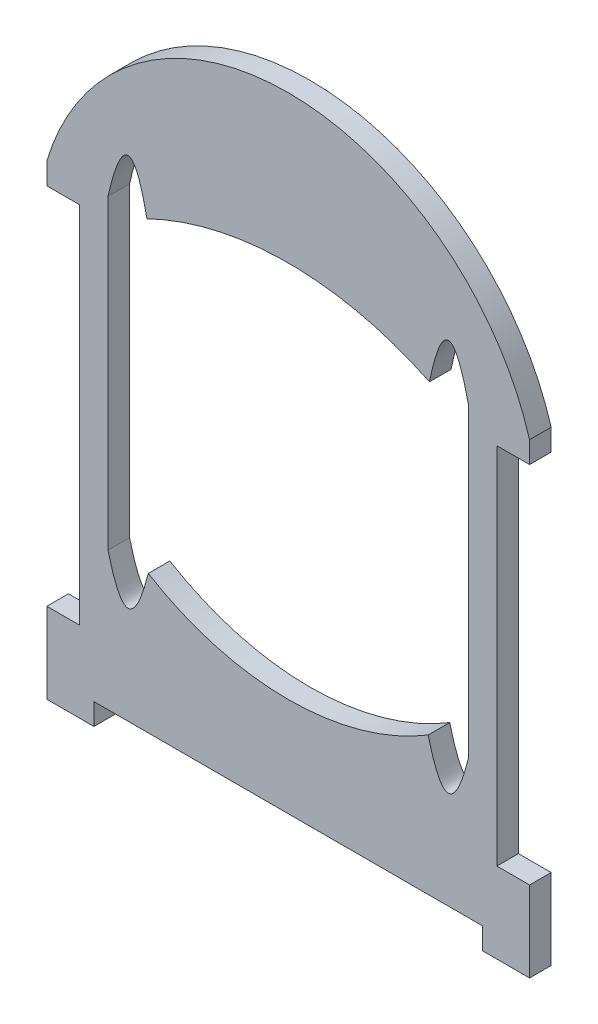
ISO-10303-21;
HEADER;
FILE_DESCRIPTION(('STEP AP214'),'2;1');
FILE_NAME('part.step','',(''),(''),'','','');
FILE_SCHEMA(('AUTOMOTIVE_DESIGN { 1 0 10303 214 1 1 1 1 }'));
ENDSEC;
DATA;
#1=APPLICATION_CONTEXT('core data for automotive mechanical design processes');
#2=APPLICATION_PROTOCOL_DEFINITION('international standard','automotive_design',2000,#1);
#3=PRODUCT_CONTEXT('',#1,'mechanical');
#4=PRODUCT('Part','Part','',(#3));
#5=PRODUCT_RELATED_PRODUCT_CATEGORY('part','',(#4));
#6=PRODUCT_DEFINITION_FORMATION('','',#4);
#7=PRODUCT_DEFINITION_CONTEXT('part definition',#1,'design');
#8=PRODUCT_DEFINITION('design','',#6,#7);
#9=PRODUCT_DEFINITION_SHAPE('','',#8);
#10=(LENGTH_UNIT() NAMED_UNIT(*) SI_UNIT(.MILLI.,.METRE.));
#11=(NAMED_UNIT(*) PLANE_ANGLE_UNIT() SI_UNIT($,.RADIAN.));
#12=(NAMED_UNIT(*) SI_UNIT($,.STERADIAN.) SOLID_ANGLE_UNIT());
#13=UNCERTAINTY_MEASURE_WITH_UNIT(LENGTH_MEASURE(1.E-05),#10,'distance_accuracy_value','');
#14=(GEOMETRIC_REPRESENTATION_CONTEXT(3) GLOBAL_UNCERTAINTY_ASSIGNED_CONTEXT((#13)) GLOBAL_UNIT_ASSIGNED_CONTEXT((#10,
#11,#12)) REPRESENTATION_CONTEXT('',''));
#15=CARTESIAN_POINT('',(0.,0.,0.));
#16=DIRECTION('',(0.,0.,1.));
#17=DIRECTION('',(1.,0.,0.));
#18=AXIS2_PLACEMENT_3D('',#15,#16,#17);
#19=CARTESIAN_POINT('',(-33.55,0.,3.));
#20=DIRECTION('',(0.,1.,0.));
#21=DIRECTION('',(-1.,0.,0.));
#22=AXIS2_PLACEMENT_3D('',#19,#20,#21);
#23=PLANE('',#22);
#24=DIRECTION('',(1.,0.,0.));
#25=VECTOR('',#24,1.);
#26=CARTESIAN_POINT('',(-33.55,0.,3.));
#27=LINE('',#26,#25);
#28=CARTESIAN_POINT('',(27.,0.,3.));
#29=VERTEX_POINT('',#28);
#30=CARTESIAN_POINT('',(33.55,0.,3.));
#31=VERTEX_POINT('',#30);
#32=EDGE_CURVE('E306',#29,#31,#27,.T.);
#33=ORIENTED_EDGE('',*,*,#32,.F.);
#34=DIRECTION('',(0.,0.,-1.));
#35=VECTOR('',#34,1.);
#36=CARTESIAN_POINT('',(27.,0.,3.));
#37=LINE('',#36,#35);
#38=CARTESIAN_POINT('',(27.,0.,0.));
#39=VERTEX_POINT('',#38);
#40=EDGE_CURVE('E47',#29,#39,#37,.T.);
#41=ORIENTED_EDGE('',*,*,#40,.T.);
#42=DIRECTION('',(1.,0.,0.));
#43=VECTOR('',#42,1.);
#44=CARTESIAN_POINT('',(-33.55,0.,0.));
#45=LINE('',#44,#43);
#46=CARTESIAN_POINT('',(33.55,0.,0.));
#47=VERTEX_POINT('',#46);
#48=EDGE_CURVE('E343',#39,#47,#45,.T.);
#49=ORIENTED_EDGE('',*,*,#48,.T.);
#50=DIRECTION('',(0.,0.,-1.));
#51=VECTOR('',#50,1.);
#52=CARTESIAN_POINT('',(33.55,0.,3.));
#53=LINE('',#52,#51);
#54=EDGE_CURVE('E309',#31,#47,#53,.T.);
#55=ORIENTED_EDGE('',*,*,#54,.F.);
#56=EDGE_LOOP('',(#33,#41,#49,#55));
#57=FACE_BOUND('',#56,.T.);
#58=ADVANCED_FACE('F39',(#57),#23,.F.);
#59=CARTESIAN_POINT('',(0.,54.78795,3.));
#60=DIRECTION('',(0.,0.,-1.));
#61=DIRECTION('',(-1.,0.,0.));
#62=AXIS2_PLACEMENT_3D('',#59,#60,#61);
#63=PLANE('',#62);
#64=DIRECTION('',(-1.,0.,0.));
#65=VECTOR('',#64,1.);
#66=CARTESIAN_POINT('',(-27.,3.00000000000001,3.));
#67=LINE('',#66,#65);
#68=CARTESIAN_POINT('',(27.,3.00000000000001,3.));
#69=VERTEX_POINT('',#68);
#70=CARTESIAN_POINT('',(-27.,3.00000000000001,3.));
#71=VERTEX_POINT('',#70);
#72=EDGE_CURVE('E204',#69,#71,#67,.T.);
#73=ORIENTED_EDGE('',*,*,#72,.F.);
#74=DIRECTION('',(0.,1.,0.));
#75=VECTOR('',#74,1.);
#76=CARTESIAN_POINT('',(27.,3.00000000000001,3.));
#77=LINE('',#76,#75);
#78=EDGE_CURVE('E211',#29,#69,#77,.T.);
#79=ORIENTED_EDGE('',*,*,#78,.F.);
#80=ORIENTED_EDGE('',*,*,#32,.T.);
#81=DIRECTION('',(0.,1.,0.));
#82=VECTOR('',#81,1.);
#83=CARTESIAN_POINT('',(33.55,0.,3.));
#84=LINE('',#83,#82);
#85=CARTESIAN_POINT('',(33.55,11.2,3.));
#86=VERTEX_POINT('',#85);
#87=EDGE_CURVE('E347',#31,#86,#84,.T.);
#88=ORIENTED_EDGE('',*,*,#87,.T.);
#89=DIRECTION('',(-1.,0.,0.));
#90=VECTOR('',#89,1.);
#91=CARTESIAN_POINT('',(33.55,11.2,3.));
#92=LINE('',#91,#90);
#93=CARTESIAN_POINT('',(29.,11.2,3.));
#94=VERTEX_POINT('',#93);
#95=EDGE_CURVE('E484',#86,#94,#92,.T.);
#96=ORIENTED_EDGE('',*,*,#95,.T.);
#97=DIRECTION('',(0.,1.,0.));
#98=VECTOR('',#97,1.);
#99=CARTESIAN_POINT('',(29.,11.2,3.));
#100=LINE('',#99,#98);
#101=CARTESIAN_POINT('',(29.,61.8,3.));
#102=VERTEX_POINT('',#101);
#103=EDGE_CURVE('E486',#94,#102,#100,.T.);
#104=ORIENTED_EDGE('',*,*,#103,.T.);
#105=DIRECTION('',(1.,0.,0.));
#106=VECTOR('',#105,1.);
#107=CARTESIAN_POINT('',(29.,61.8,3.));
#108=LINE('',#107,#106);
#109=CARTESIAN_POINT('',(33.55,61.8,3.));
#110=VERTEX_POINT('',#109);
#111=EDGE_CURVE('E488',#102,#110,#108,.T.);
#112=ORIENTED_EDGE('',*,*,#111,.T.);
#113=DIRECTION('',(0.,1.,0.));
#114=VECTOR('',#113,1.);
#115=CARTESIAN_POINT('',(33.55,61.8,3.));
#116=LINE('',#115,#114);
#117=CARTESIAN_POINT('',(33.55,64.8,3.));
#118=VERTEX_POINT('',#117);
#119=EDGE_CURVE('E490',#110,#118,#116,.T.);
#120=ORIENTED_EDGE('',*,*,#119,.T.);
#121=CARTESIAN_POINT('',(0.,54.78795,3.));
#122=DIRECTION('',(0.,0.,1.));
#123=DIRECTION('',(-1.,0.,0.));
#124=AXIS2_PLACEMENT_3D('',#121,#122,#123);
#125=CIRCLE('',#124,35.01205);
#126=CARTESIAN_POINT('',(-33.55,64.8,3.));
#127=VERTEX_POINT('',#126);
#128=EDGE_CURVE('E492',#118,#127,#125,.T.);
#129=ORIENTED_EDGE('',*,*,#128,.T.);
#130=DIRECTION('',(0.,-1.,0.));
#131=VECTOR('',#130,1.);
#132=CARTESIAN_POINT('',(-33.55,61.8,3.));
#133=LINE('',#132,#131);
#134=CARTESIAN_POINT('',(-33.55,61.8,3.));
#135=VERTEX_POINT('',#134);
#136=EDGE_CURVE('E494',#127,#135,#133,.T.);
#137=ORIENTED_EDGE('',*,*,#136,.T.);
#138=DIRECTION('',(1.,0.,0.));
#139=VECTOR('',#138,1.);
#140=CARTESIAN_POINT('',(-29.,61.8,3.));
#141=LINE('',#140,#139);
#142=CARTESIAN_POINT('',(-29.,61.8,3.));
#143=VERTEX_POINT('',#142);
#144=EDGE_CURVE('E496',#135,#143,#141,.T.);
#145=ORIENTED_EDGE('',*,*,#144,.T.);
#146=DIRECTION('',(0.,-1.,0.));
#147=VECTOR('',#146,1.);
#148=CARTESIAN_POINT('',(-29.,11.2,3.));
#149=LINE('',#148,#147);
#150=CARTESIAN_POINT('',(-29.,11.2,3.));
#151=VERTEX_POINT('',#150);
#152=EDGE_CURVE('E498',#143,#151,#149,.T.);
#153=ORIENTED_EDGE('',*,*,#152,.T.);
#154=DIRECTION('',(-1.,0.,0.));
#155=VECTOR('',#154,1.);
#156=CARTESIAN_POINT('',(-33.55,11.2,3.));
#157=LINE('',#156,#155);
#158=CARTESIAN_POINT('',(-33.55,11.2,3.));
#159=VERTEX_POINT('',#158);
#160=EDGE_CURVE('E315',#151,#159,#157,.T.);
#161=ORIENTED_EDGE('',*,*,#160,.T.);
#162=DIRECTION('',(0.,-1.,0.));
#163=VECTOR('',#162,1.);
#164=CARTESIAN_POINT('',(-33.55,0.,3.));
#165=LINE('',#164,#163);
#166=CARTESIAN_POINT('',(-33.55,0.,3.));
#167=VERTEX_POINT('',#166);
#168=EDGE_CURVE('E313',#159,#167,#165,.T.);
#169=ORIENTED_EDGE('',*,*,#168,.T.);
#170=CARTESIAN_POINT('',(-27.,0.,3.));
#171=VERTEX_POINT('',#170);
#172=EDGE_CURVE('E312',#167,#171,#27,.T.);
#173=ORIENTED_EDGE('',*,*,#172,.T.);
#174=DIRECTION('',(0.,-1.,0.));
#175=VECTOR('',#174,1.);
#176=CARTESIAN_POINT('',(-27.,0.,3.));
#177=LINE('',#176,#175);
#178=EDGE_CURVE('E54',#71,#171,#177,.T.);
#179=ORIENTED_EDGE('',*,*,#178,.F.);
#180=EDGE_LOOP('',(#73,#79,#80,#88,#96,#104,#112,#120,#129,#137,#145,#153,#161,#169,#173,#179));
#181=FACE_BOUND('',#180,.T.);
#182=CARTESIAN_POINT('',(-19.6329415672845,64.8,3.));
#183=CARTESIAN_POINT('',(-22.187059741983,77.4003496274557,3.));
#184=CARTESIAN_POINT('',(-25.05,64.8,3.));
#185=B_SPLINE_CURVE_WITH_KNOTS('',2,(#182,#183,#184),.UNSPECIFIED.,.F.,.F.,(3,3),(0.,1.),.UNSPECIFIED.);
#186=CARTESIAN_POINT('',(-19.6329415672845,64.8,3.));
#187=VERTEX_POINT('',#186);
#188=CARTESIAN_POINT('',(-25.05,64.8,3.));
#189=VERTEX_POINT('',#188);
#190=EDGE_CURVE('E229',#187,#189,#185,.T.);
#191=ORIENTED_EDGE('',*,*,#190,.F.);
#192=CARTESIAN_POINT('',(0.,24.2219561572877,3.));
#193=DIRECTION('',(0.,0.,1.));
#194=DIRECTION('',(1.,0.,0.));
#195=AXIS2_PLACEMENT_3D('',#192,#193,#194);
#196=CIRCLE('',#195,45.0780438427122);
#197=CARTESIAN_POINT('',(19.6329415672845,64.8,3.));
#198=VERTEX_POINT('',#197);
#199=EDGE_CURVE('E418',#198,#187,#196,.T.);
#200=ORIENTED_EDGE('',*,*,#199,.F.);
#201=CARTESIAN_POINT('',(25.05,64.8,3.));
#202=CARTESIAN_POINT('',(22.187059741983,77.4003496274557,3.));
#203=CARTESIAN_POINT('',(19.6329415672845,64.8,3.));
#204=B_SPLINE_CURVE_WITH_KNOTS('',2,(#201,#202,#203),.UNSPECIFIED.,.F.,.F.,(3,3),(0.,1.),.UNSPECIFIED.);
#205=CARTESIAN_POINT('',(25.05,64.8,3.));
#206=VERTEX_POINT('',#205);
#207=EDGE_CURVE('E412',#206,#198,#204,.T.);
#208=ORIENTED_EDGE('',*,*,#207,.F.);
#209=DIRECTION('',(0.,1.,0.));
#210=VECTOR('',#209,1.);
#211=CARTESIAN_POINT('',(25.05,22.2,3.));
#212=LINE('',#211,#210);
#213=CARTESIAN_POINT('',(25.05,22.2,3.));
#214=VERTEX_POINT('',#213);
#215=EDGE_CURVE('E419',#214,#206,#212,.T.);
#216=ORIENTED_EDGE('',*,*,#215,.F.);
#217=CARTESIAN_POINT('',(19.45,22.2,3.));
#218=CARTESIAN_POINT('',(22.25,11.,3.));
#219=CARTESIAN_POINT('',(25.05,22.2,3.));
#220=B_SPLINE_CURVE_WITH_KNOTS('',2,(#217,#218,#219),.UNSPECIFIED.,.F.,.F.,(3,3),(0.,1.),.UNSPECIFIED.);
#221=CARTESIAN_POINT('',(19.45,22.2,3.));
#222=VERTEX_POINT('',#221);
#223=EDGE_CURVE('E538',#222,#214,#220,.T.);
#224=ORIENTED_EDGE('',*,*,#223,.F.);
#225=CARTESIAN_POINT('',(0.,54.1816513761469,3.));
#226=DIRECTION('',(0.,0.,1.));
#227=DIRECTION('',(1.,0.,0.));
#228=AXIS2_PLACEMENT_3D('',#225,#226,#227);
#229=CIRCLE('',#228,37.4316513761469);
#230=CARTESIAN_POINT('',(-19.45,22.2,3.));
#231=VERTEX_POINT('',#230);
#232=EDGE_CURVE('E535',#231,#222,#229,.T.);
#233=ORIENTED_EDGE('',*,*,#232,.F.);
#234=CARTESIAN_POINT('',(-25.05,22.2,3.));
#235=CARTESIAN_POINT('',(-22.25,11.,3.));
#236=CARTESIAN_POINT('',(-19.45,22.2,3.));
#237=B_SPLINE_CURVE_WITH_KNOTS('',2,(#234,#235,#236),.UNSPECIFIED.,.F.,.F.,(3,3),(0.,1.),.UNSPECIFIED.);
#238=CARTESIAN_POINT('',(-25.05,22.2,3.));
#239=VERTEX_POINT('',#238);
#240=EDGE_CURVE('E533',#239,#231,#237,.T.);
#241=ORIENTED_EDGE('',*,*,#240,.F.);
#242=DIRECTION('',(0.,-1.,0.));
#243=VECTOR('',#242,1.);
#244=CARTESIAN_POINT('',(-25.05,64.8,3.));
#245=LINE('',#244,#243);
#246=EDGE_CURVE('E234',#189,#239,#245,.T.);
#247=ORIENTED_EDGE('',*,*,#246,.F.);
#248=EDGE_LOOP('',(#191,#200,#208,#216,#224,#233,#241,#247));
#249=FACE_BOUND('',#248,.T.);
#250=ADVANCED_FACE('F217',(#181,#249),#63,.F.);
#251=CARTESIAN_POINT('',(0.,54.78795,0.));
#252=DIRECTION('',(0.,0.,-1.));
#253=DIRECTION('',(-1.,0.,0.));
#254=AXIS2_PLACEMENT_3D('',#251,#252,#253);
#255=PLANE('',#254);
#256=DIRECTION('',(0.,-1.,0.));
#257=VECTOR('',#256,1.);
#258=CARTESIAN_POINT('',(27.0000000000001,54.7879499999999,0.));
#259=LINE('',#258,#257);
#260=CARTESIAN_POINT('',(27.,3.00000000000001,0.));
#261=VERTEX_POINT('',#260);
#262=EDGE_CURVE('E226',#261,#39,#259,.T.);
#263=ORIENTED_EDGE('',*,*,#262,.F.);
#264=DIRECTION('',(1.,0.,0.));
#265=VECTOR('',#264,1.);
#266=CARTESIAN_POINT('',(0.,3.00000000000002,0.));
#267=LINE('',#266,#265);
#268=CARTESIAN_POINT('',(-27.,3.00000000000001,0.));
#269=VERTEX_POINT('',#268);
#270=EDGE_CURVE('E11',#269,#261,#267,.T.);
#271=ORIENTED_EDGE('',*,*,#270,.F.);
#272=DIRECTION('',(0.,1.,0.));
#273=VECTOR('',#272,1.);
#274=CARTESIAN_POINT('',(-27.,54.78795,0.));
#275=LINE('',#274,#273);
#276=CARTESIAN_POINT('',(-27.,0.,0.));
#277=VERTEX_POINT('',#276);
#278=EDGE_CURVE('E223',#277,#269,#275,.T.);
#279=ORIENTED_EDGE('',*,*,#278,.F.);
#280=CARTESIAN_POINT('',(-33.55,0.,0.));
#281=VERTEX_POINT('',#280);
#282=EDGE_CURVE('E344',#281,#277,#45,.T.);
#283=ORIENTED_EDGE('',*,*,#282,.F.);
#284=DIRECTION('',(0.,-1.,0.));
#285=VECTOR('',#284,1.);
#286=CARTESIAN_POINT('',(-33.55,0.,0.));
#287=LINE('',#286,#285);
#288=CARTESIAN_POINT('',(-33.55,11.2,0.));
#289=VERTEX_POINT('',#288);
#290=EDGE_CURVE('E341',#289,#281,#287,.T.);
#291=ORIENTED_EDGE('',*,*,#290,.F.);
#292=DIRECTION('',(-1.,0.,0.));
#293=VECTOR('',#292,1.);
#294=CARTESIAN_POINT('',(-33.55,11.2,0.));
#295=LINE('',#294,#293);
#296=CARTESIAN_POINT('',(-29.,11.2,0.));
#297=VERTEX_POINT('',#296);
#298=EDGE_CURVE('E339',#297,#289,#295,.T.);
#299=ORIENTED_EDGE('',*,*,#298,.F.);
#300=DIRECTION('',(0.,-1.,0.));
#301=VECTOR('',#300,1.);
#302=CARTESIAN_POINT('',(-29.,11.2,0.));
#303=LINE('',#302,#301);
#304=CARTESIAN_POINT('',(-29.,61.8,0.));
#305=VERTEX_POINT('',#304);
#306=EDGE_CURVE('E337',#305,#297,#303,.T.);
#307=ORIENTED_EDGE('',*,*,#306,.F.);
#308=DIRECTION('',(1.,0.,0.));
#309=VECTOR('',#308,1.);
#310=CARTESIAN_POINT('',(-29.,61.8,0.));
#311=LINE('',#310,#309);
#312=CARTESIAN_POINT('',(-33.55,61.8,0.));
#313=VERTEX_POINT('',#312);
#314=EDGE_CURVE('E335',#313,#305,#311,.T.);
#315=ORIENTED_EDGE('',*,*,#314,.F.);
#316=DIRECTION('',(0.,-1.,0.));
#317=VECTOR('',#316,1.);
#318=CARTESIAN_POINT('',(-33.55,61.8,0.));
#319=LINE('',#318,#317);
#320=CARTESIAN_POINT('',(-33.55,64.8,0.));
#321=VERTEX_POINT('',#320);
#322=EDGE_CURVE('E333',#321,#313,#319,.T.);
#323=ORIENTED_EDGE('',*,*,#322,.F.);
#324=CARTESIAN_POINT('',(0.,54.78795,0.));
#325=DIRECTION('',(0.,0.,1.));
#326=DIRECTION('',(-1.,0.,0.));
#327=AXIS2_PLACEMENT_3D('',#324,#325,#326);
#328=CIRCLE('',#327,35.01205);
#329=CARTESIAN_POINT('',(33.55,64.8,0.));
#330=VERTEX_POINT('',#329);
#331=EDGE_CURVE('E331',#330,#321,#328,.T.);
#332=ORIENTED_EDGE('',*,*,#331,.F.);
#333=DIRECTION('',(0.,1.,0.));
#334=VECTOR('',#333,1.);
#335=CARTESIAN_POINT('',(33.55,61.8,0.));
#336=LINE('',#335,#334);
#337=CARTESIAN_POINT('',(33.55,61.8,0.));
#338=VERTEX_POINT('',#337);
#339=EDGE_CURVE('E329',#338,#330,#336,.T.);
#340=ORIENTED_EDGE('',*,*,#339,.F.);
#341=DIRECTION('',(1.,0.,0.));
#342=VECTOR('',#341,1.);
#343=CARTESIAN_POINT('',(29.,61.8,0.));
#344=LINE('',#343,#342);
#345=CARTESIAN_POINT('',(29.,61.8,0.));
#346=VERTEX_POINT('',#345);
#347=EDGE_CURVE('E327',#346,#338,#344,.T.);
#348=ORIENTED_EDGE('',*,*,#347,.F.);
#349=DIRECTION('',(0.,1.,0.));
#350=VECTOR('',#349,1.);
#351=CARTESIAN_POINT('',(29.,11.2,0.));
#352=LINE('',#351,#350);
#353=CARTESIAN_POINT('',(29.,11.2,0.));
#354=VERTEX_POINT('',#353);
#355=EDGE_CURVE('E325',#354,#346,#352,.T.);
#356=ORIENTED_EDGE('',*,*,#355,.F.);
#357=DIRECTION('',(-1.,0.,0.));
#358=VECTOR('',#357,1.);
#359=CARTESIAN_POINT('',(33.55,11.2,0.));
#360=LINE('',#359,#358);
#361=CARTESIAN_POINT('',(33.55,11.2,0.));
#362=VERTEX_POINT('',#361);
#363=EDGE_CURVE('E322',#362,#354,#360,.T.);
#364=ORIENTED_EDGE('',*,*,#363,.F.);
#365=DIRECTION('',(0.,1.,0.));
#366=VECTOR('',#365,1.);
#367=CARTESIAN_POINT('',(33.55,0.,0.));
#368=LINE('',#367,#366);
#369=EDGE_CURVE('E319',#47,#362,#368,.T.);
#370=ORIENTED_EDGE('',*,*,#369,.F.);
#371=ORIENTED_EDGE('',*,*,#48,.F.);
#372=EDGE_LOOP('',(#263,#271,#279,#283,#291,#299,#307,#315,#323,#332,#340,#348,#356,#364,#370,#371));
#373=FACE_BOUND('',#372,.T.);
#374=CARTESIAN_POINT('',(0.,24.2219561572877,0.));
#375=DIRECTION('',(0.,0.,1.));
#376=DIRECTION('',(1.,0.,0.));
#377=AXIS2_PLACEMENT_3D('',#374,#375,#376);
#378=CIRCLE('',#377,45.0780438427122);
#379=CARTESIAN_POINT('',(19.6329415672845,64.8,0.));
#380=VERTEX_POINT('',#379);
#381=CARTESIAN_POINT('',(-19.6329415672845,64.8,0.));
#382=VERTEX_POINT('',#381);
#383=EDGE_CURVE('E235',#380,#382,#378,.T.);
#384=ORIENTED_EDGE('',*,*,#383,.T.);
#385=CARTESIAN_POINT('',(-19.6329415672845,64.8,0.));
#386=CARTESIAN_POINT('',(-22.187059741983,77.4003496274557,0.));
#387=CARTESIAN_POINT('',(-25.05,64.8,0.));
#388=B_SPLINE_CURVE_WITH_KNOTS('',2,(#385,#386,#387),.UNSPECIFIED.,.F.,.F.,(3,3),(0.,1.),.UNSPECIFIED.);
#389=CARTESIAN_POINT('',(-25.05,64.8,0.));
#390=VERTEX_POINT('',#389);
#391=EDGE_CURVE('E228',#382,#390,#388,.T.);
#392=ORIENTED_EDGE('',*,*,#391,.T.);
#393=DIRECTION('',(0.,-1.,0.));
#394=VECTOR('',#393,1.);
#395=CARTESIAN_POINT('',(-25.05,64.8,0.));
#396=LINE('',#395,#394);
#397=CARTESIAN_POINT('',(-25.05,22.2,0.));
#398=VERTEX_POINT('',#397);
#399=EDGE_CURVE('E430',#390,#398,#396,.T.);
#400=ORIENTED_EDGE('',*,*,#399,.T.);
#401=CARTESIAN_POINT('',(-25.05,22.2,0.));
#402=CARTESIAN_POINT('',(-22.25,11.,0.));
#403=CARTESIAN_POINT('',(-19.45,22.2,0.));
#404=B_SPLINE_CURVE_WITH_KNOTS('',2,(#401,#402,#403),.UNSPECIFIED.,.F.,.F.,(3,3),(0.,1.),.UNSPECIFIED.);
#405=CARTESIAN_POINT('',(-19.45,22.2,0.));
#406=VERTEX_POINT('',#405);
#407=EDGE_CURVE('E436',#398,#406,#404,.T.);
#408=ORIENTED_EDGE('',*,*,#407,.T.);
#409=CARTESIAN_POINT('',(0.,54.1816513761469,0.));
#410=DIRECTION('',(0.,0.,1.));
#411=DIRECTION('',(1.,0.,0.));
#412=AXIS2_PLACEMENT_3D('',#409,#410,#411);
#413=CIRCLE('',#412,37.4316513761469);
#414=CARTESIAN_POINT('',(19.45,22.2,0.));
#415=VERTEX_POINT('',#414);
#416=EDGE_CURVE('E441',#406,#415,#413,.T.);
#417=ORIENTED_EDGE('',*,*,#416,.T.);
#418=CARTESIAN_POINT('',(19.45,22.2,0.));
#419=CARTESIAN_POINT('',(22.25,11.,0.));
#420=CARTESIAN_POINT('',(25.05,22.2,0.));
#421=B_SPLINE_CURVE_WITH_KNOTS('',2,(#418,#419,#420),.UNSPECIFIED.,.F.,.F.,(3,3),(0.,1.),.UNSPECIFIED.);
#422=CARTESIAN_POINT('',(25.05,22.2,0.));
#423=VERTEX_POINT('',#422);
#424=EDGE_CURVE('E447',#415,#423,#421,.T.);
#425=ORIENTED_EDGE('',*,*,#424,.T.);
#426=DIRECTION('',(0.,1.,0.));
#427=VECTOR('',#426,1.);
#428=CARTESIAN_POINT('',(25.05,22.2,0.));
#429=LINE('',#428,#427);
#430=CARTESIAN_POINT('',(25.05,64.8,0.));
#431=VERTEX_POINT('',#430);
#432=EDGE_CURVE('E452',#423,#431,#429,.T.);
#433=ORIENTED_EDGE('',*,*,#432,.T.);
#434=CARTESIAN_POINT('',(25.05,64.8,0.));
#435=CARTESIAN_POINT('',(22.187059741983,77.4003496274557,0.));
#436=CARTESIAN_POINT('',(19.6329415672845,64.8,0.));
#437=B_SPLINE_CURVE_WITH_KNOTS('',2,(#434,#435,#436),.UNSPECIFIED.,.F.,.F.,(3,3),(0.,1.),.UNSPECIFIED.);
#438=EDGE_CURVE('E458',#431,#380,#437,.T.);
#439=ORIENTED_EDGE('',*,*,#438,.T.);
#440=EDGE_LOOP('',(#384,#392,#400,#408,#417,#425,#433,#439));
#441=FACE_BOUND('',#440,.T.);
#442=ADVANCED_FACE('F251',(#373,#441),#255,.T.);
#443=CARTESIAN_POINT('',(33.55,0.,3.));
#444=DIRECTION('',(-1.,0.,0.));
#445=DIRECTION('',(0.,-1.,0.));
#446=AXIS2_PLACEMENT_3D('',#443,#444,#445);
#447=PLANE('',#446);
#448=ORIENTED_EDGE('',*,*,#369,.T.);
#449=DIRECTION('',(0.,0.,-1.));
#450=VECTOR('',#449,1.);
#451=CARTESIAN_POINT('',(33.55,11.2,3.));
#452=LINE('',#451,#450);
#453=EDGE_CURVE('E379',#86,#362,#452,.T.);
#454=ORIENTED_EDGE('',*,*,#453,.F.);
#455=ORIENTED_EDGE('',*,*,#87,.F.);
#456=ORIENTED_EDGE('',*,*,#54,.T.);
#457=EDGE_LOOP('',(#448,#454,#455,#456));
#458=FACE_BOUND('',#457,.T.);
#459=ADVANCED_FACE('F41',(#458),#447,.F.);
#460=CARTESIAN_POINT('',(33.55,11.2,3.));
#461=DIRECTION('',(0.,-1.,0.));
#462=DIRECTION('',(1.,0.,0.));
#463=AXIS2_PLACEMENT_3D('',#460,#461,#462);
#464=PLANE('',#463);
#465=ORIENTED_EDGE('',*,*,#363,.T.);
#466=DIRECTION('',(0.,0.,-1.));
#467=VECTOR('',#466,1.);
#468=CARTESIAN_POINT('',(29.,11.2,3.));
#469=LINE('',#468,#467);
#470=EDGE_CURVE('E376',#94,#354,#469,.T.);
#471=ORIENTED_EDGE('',*,*,#470,.F.);
#472=ORIENTED_EDGE('',*,*,#95,.F.);
#473=ORIENTED_EDGE('',*,*,#453,.T.);
#474=EDGE_LOOP('',(#465,#471,#472,#473));
#475=FACE_BOUND('',#474,.T.);
#476=ADVANCED_FACE('F292',(#475),#464,.F.);
#477=CARTESIAN_POINT('',(29.,11.2,3.));
#478=DIRECTION('',(-1.,0.,0.));
#479=DIRECTION('',(0.,-1.,0.));
#480=AXIS2_PLACEMENT_3D('',#477,#478,#479);
#481=PLANE('',#480);
#482=ORIENTED_EDGE('',*,*,#355,.T.);
#483=DIRECTION('',(0.,0.,-1.));
#484=VECTOR('',#483,1.);
#485=CARTESIAN_POINT('',(29.,61.8,3.));
#486=LINE('',#485,#484);
#487=EDGE_CURVE('E373',#102,#346,#486,.T.);
#488=ORIENTED_EDGE('',*,*,#487,.F.);
#489=ORIENTED_EDGE('',*,*,#103,.F.);
#490=ORIENTED_EDGE('',*,*,#470,.T.);
#491=EDGE_LOOP('',(#482,#488,#489,#490));
#492=FACE_BOUND('',#491,.T.);
#493=ADVANCED_FACE('F289',(#492),#481,.F.);
#494=CARTESIAN_POINT('',(29.,61.8,3.));
#495=DIRECTION('',(0.,1.,0.));
#496=DIRECTION('',(0.,0.,1.));
#497=AXIS2_PLACEMENT_3D('',#494,#495,#496);
#498=PLANE('',#497);
#499=ORIENTED_EDGE('',*,*,#347,.T.);
#500=DIRECTION('',(0.,0.,-1.));
#501=VECTOR('',#500,1.);
#502=CARTESIAN_POINT('',(33.55,61.8,3.));
#503=LINE('',#502,#501);
#504=EDGE_CURVE('E370',#110,#338,#503,.T.);
#505=ORIENTED_EDGE('',*,*,#504,.F.);
#506=ORIENTED_EDGE('',*,*,#111,.F.);
#507=ORIENTED_EDGE('',*,*,#487,.T.);
#508=EDGE_LOOP('',(#499,#505,#506,#507));
#509=FACE_BOUND('',#508,.T.);
#510=ADVANCED_FACE('F285',(#509),#498,.F.);
#511=CARTESIAN_POINT('',(33.55,61.8,3.));
#512=DIRECTION('',(-1.,0.,0.));
#513=DIRECTION('',(0.,0.,1.));
#514=AXIS2_PLACEMENT_3D('',#511,#512,#513);
#515=PLANE('',#514);
#516=ORIENTED_EDGE('',*,*,#339,.T.);
#517=DIRECTION('',(0.,0.,-1.));
#518=VECTOR('',#517,1.);
#519=CARTESIAN_POINT('',(33.55,64.8,3.));
#520=LINE('',#519,#518);
#521=EDGE_CURVE('E367',#118,#330,#520,.T.);
#522=ORIENTED_EDGE('',*,*,#521,.F.);
#523=ORIENTED_EDGE('',*,*,#119,.F.);
#524=ORIENTED_EDGE('',*,*,#504,.T.);
#525=EDGE_LOOP('',(#516,#522,#523,#524));
#526=FACE_BOUND('',#525,.T.);
#527=ADVANCED_FACE('F281',(#526),#515,.F.);
#528=CARTESIAN_POINT('',(0.,54.78795,3.));
#529=DIRECTION('',(0.,0.,-1.));
#530=DIRECTION('',(-1.,0.,0.));
#531=AXIS2_PLACEMENT_3D('',#528,#529,#530);
#532=CYLINDRICAL_SURFACE('',#531,35.01205);
#533=ORIENTED_EDGE('',*,*,#331,.T.);
#534=DIRECTION('',(0.,0.,-1.));
#535=VECTOR('',#534,1.);
#536=CARTESIAN_POINT('',(-33.55,64.8,3.));
#537=LINE('',#536,#535);
#538=EDGE_CURVE('E364',#127,#321,#537,.T.);
#539=ORIENTED_EDGE('',*,*,#538,.F.);
#540=ORIENTED_EDGE('',*,*,#128,.F.);
#541=ORIENTED_EDGE('',*,*,#521,.T.);
#542=EDGE_LOOP('',(#533,#539,#540,#541));
#543=FACE_BOUND('',#542,.T.);
#544=ADVANCED_FACE('F277',(#543),#532,.T.);
#545=CARTESIAN_POINT('',(-33.55,61.8,3.));
#546=DIRECTION('',(1.,0.,0.));
#547=DIRECTION('',(0.,0.,-1.));
#548=AXIS2_PLACEMENT_3D('',#545,#546,#547);
#549=PLANE('',#548);
#550=ORIENTED_EDGE('',*,*,#322,.T.);
#551=DIRECTION('',(0.,0.,-1.));
#552=VECTOR('',#551,1.);
#553=CARTESIAN_POINT('',(-33.55,61.8,3.));
#554=LINE('',#553,#552);
#555=EDGE_CURVE('E361',#135,#313,#554,.T.);
#556=ORIENTED_EDGE('',*,*,#555,.F.);
#557=ORIENTED_EDGE('',*,*,#136,.F.);
#558=ORIENTED_EDGE('',*,*,#538,.T.);
#559=EDGE_LOOP('',(#550,#556,#557,#558));
#560=FACE_BOUND('',#559,.T.);
#561=ADVANCED_FACE('F273',(#560),#549,.F.);
#562=CARTESIAN_POINT('',(-29.,61.8,3.));
#563=DIRECTION('',(0.,1.,0.));
#564=DIRECTION('',(-1.,0.,0.));
#565=AXIS2_PLACEMENT_3D('',#562,#563,#564);
#566=PLANE('',#565);
#567=ORIENTED_EDGE('',*,*,#314,.T.);
#568=DIRECTION('',(0.,0.,-1.));
#569=VECTOR('',#568,1.);
#570=CARTESIAN_POINT('',(-29.,61.8,3.));
#571=LINE('',#570,#569);
#572=EDGE_CURVE('E358',#143,#305,#571,.T.);
#573=ORIENTED_EDGE('',*,*,#572,.F.);
#574=ORIENTED_EDGE('',*,*,#144,.F.);
#575=ORIENTED_EDGE('',*,*,#555,.T.);
#576=EDGE_LOOP('',(#567,#573,#574,#575));
#577=FACE_BOUND('',#576,.T.);
#578=ADVANCED_FACE('F269',(#577),#566,.F.);
#579=CARTESIAN_POINT('',(-29.,11.2,3.));
#580=DIRECTION('',(1.,0.,0.));
#581=DIRECTION('',(0.,1.,0.));
#582=AXIS2_PLACEMENT_3D('',#579,#580,#581);
#583=PLANE('',#582);
#584=ORIENTED_EDGE('',*,*,#306,.T.);
#585=DIRECTION('',(0.,0.,-1.));
#586=VECTOR('',#585,1.);
#587=CARTESIAN_POINT('',(-29.,11.2,3.));
#588=LINE('',#587,#586);
#589=EDGE_CURVE('E355',#151,#297,#588,.T.);
#590=ORIENTED_EDGE('',*,*,#589,.F.);
#591=ORIENTED_EDGE('',*,*,#152,.F.);
#592=ORIENTED_EDGE('',*,*,#572,.T.);
#593=EDGE_LOOP('',(#584,#590,#591,#592));
#594=FACE_BOUND('',#593,.T.);
#595=ADVANCED_FACE('F265',(#594),#583,.F.);
#596=CARTESIAN_POINT('',(-33.55,11.2,3.));
#597=DIRECTION('',(0.,-1.,0.));
#598=DIRECTION('',(0.,0.,-1.));
#599=AXIS2_PLACEMENT_3D('',#596,#597,#598);
#600=PLANE('',#599);
#601=ORIENTED_EDGE('',*,*,#298,.T.);
#602=DIRECTION('',(0.,0.,-1.));
#603=VECTOR('',#602,1.);
#604=CARTESIAN_POINT('',(-33.55,11.2,3.));
#605=LINE('',#604,#603);
#606=EDGE_CURVE('E352',#159,#289,#605,.T.);
#607=ORIENTED_EDGE('',*,*,#606,.F.);
#608=ORIENTED_EDGE('',*,*,#160,.F.);
#609=ORIENTED_EDGE('',*,*,#589,.T.);
#610=EDGE_LOOP('',(#601,#607,#608,#609));
#611=FACE_BOUND('',#610,.T.);
#612=ADVANCED_FACE('F261',(#611),#600,.F.);
#613=CARTESIAN_POINT('',(-33.55,0.,3.));
#614=DIRECTION('',(1.,0.,0.));
#615=DIRECTION('',(0.,1.,0.));
#616=AXIS2_PLACEMENT_3D('',#613,#614,#615);
#617=PLANE('',#616);
#618=ORIENTED_EDGE('',*,*,#290,.T.);
#619=DIRECTION('',(0.,0.,-1.));
#620=VECTOR('',#619,1.);
#621=CARTESIAN_POINT('',(-33.55,0.,3.));
#622=LINE('',#621,#620);
#623=EDGE_CURVE('E349',#167,#281,#622,.T.);
#624=ORIENTED_EDGE('',*,*,#623,.F.);
#625=ORIENTED_EDGE('',*,*,#168,.F.);
#626=ORIENTED_EDGE('',*,*,#606,.T.);
#627=EDGE_LOOP('',(#618,#624,#625,#626));
#628=FACE_BOUND('',#627,.T.);
#629=ADVANCED_FACE('F257',(#628),#617,.F.);
#630=ORIENTED_EDGE('',*,*,#282,.T.);
#631=DIRECTION('',(0.,0.,1.));
#632=VECTOR('',#631,1.);
#633=CARTESIAN_POINT('',(-27.,0.,3.));
#634=LINE('',#633,#632);
#635=EDGE_CURVE('E382',#277,#171,#634,.T.);
#636=ORIENTED_EDGE('',*,*,#635,.T.);
#637=ORIENTED_EDGE('',*,*,#172,.F.);
#638=ORIENTED_EDGE('',*,*,#623,.T.);
#639=EDGE_LOOP('',(#630,#636,#637,#638));
#640=FACE_BOUND('',#639,.T.);
#641=ADVANCED_FACE('F246',(#640),#23,.F.);
#642=DIRECTION('',(0.,0.,-1.));
#643=VECTOR('',#642,1.);
#644=SURFACE_OF_LINEAR_EXTRUSION('',#185,#643);
#645=ORIENTED_EDGE('',*,*,#391,.F.);
#646=DIRECTION('',(0.,0.,-1.));
#647=VECTOR('',#646,1.);
#648=CARTESIAN_POINT('',(-19.6329415672845,64.8,3.));
#649=LINE('',#648,#647);
#650=EDGE_CURVE('E425',#187,#382,#649,.T.);
#651=ORIENTED_EDGE('',*,*,#650,.F.);
#652=ORIENTED_EDGE('',*,*,#190,.T.);
#653=DIRECTION('',(0.,0.,-1.));
#654=VECTOR('',#653,1.);
#655=CARTESIAN_POINT('',(-25.05,64.8,3.));
#656=LINE('',#655,#654);
#657=EDGE_CURVE('E323',#189,#390,#656,.T.);
#658=ORIENTED_EDGE('',*,*,#657,.T.);
#659=EDGE_LOOP('',(#645,#651,#652,#658));
#660=FACE_BOUND('',#659,.T.);
#661=ADVANCED_FACE('F241',(#660),#644,.T.);
#662=CARTESIAN_POINT('',(-25.05,64.8,3.));
#663=DIRECTION('',(1.,0.,0.));
#664=DIRECTION('',(0.,1.,0.));
#665=AXIS2_PLACEMENT_3D('',#662,#663,#664);
#666=PLANE('',#665);
#667=ORIENTED_EDGE('',*,*,#399,.F.);
#668=ORIENTED_EDGE('',*,*,#657,.F.);
#669=ORIENTED_EDGE('',*,*,#246,.T.);
#670=DIRECTION('',(0.,0.,-1.));
#671=VECTOR('',#670,1.);
#672=CARTESIAN_POINT('',(-25.05,22.2,3.));
#673=LINE('',#672,#671);
#674=EDGE_CURVE('E479',#239,#398,#673,.T.);
#675=ORIENTED_EDGE('',*,*,#674,.T.);
#676=EDGE_LOOP('',(#667,#668,#669,#675));
#677=FACE_BOUND('',#676,.T.);
#678=ADVANCED_FACE('F245',(#677),#666,.T.);
#679=DIRECTION('',(0.,0.,-1.));
#680=VECTOR('',#679,1.);
#681=SURFACE_OF_LINEAR_EXTRUSION('',#237,#680);
#682=ORIENTED_EDGE('',*,*,#407,.F.);
#683=ORIENTED_EDGE('',*,*,#674,.F.);
#684=ORIENTED_EDGE('',*,*,#240,.T.);
#685=DIRECTION('',(0.,0.,-1.));
#686=VECTOR('',#685,1.);
#687=CARTESIAN_POINT('',(-19.45,22.2,3.));
#688=LINE('',#687,#686);
#689=EDGE_CURVE('E477',#231,#406,#688,.T.);
#690=ORIENTED_EDGE('',*,*,#689,.T.);
#691=EDGE_LOOP('',(#682,#683,#684,#690));
#692=FACE_BOUND('',#691,.T.);
#693=ADVANCED_FACE('F546',(#692),#681,.T.);
#694=CARTESIAN_POINT('',(0.,54.1816513761469,3.));
#695=DIRECTION('',(0.,0.,-1.));
#696=DIRECTION('',(-1.,0.,0.));
#697=AXIS2_PLACEMENT_3D('',#694,#695,#696);
#698=CYLINDRICAL_SURFACE('',#697,37.4316513761469);
#699=ORIENTED_EDGE('',*,*,#416,.F.);
#700=ORIENTED_EDGE('',*,*,#689,.F.);
#701=ORIENTED_EDGE('',*,*,#232,.T.);
#702=DIRECTION('',(0.,0.,-1.));
#703=VECTOR('',#702,1.);
#704=CARTESIAN_POINT('',(19.45,22.2,3.));
#705=LINE('',#704,#703);
#706=EDGE_CURVE('E475',#222,#415,#705,.T.);
#707=ORIENTED_EDGE('',*,*,#706,.T.);
#708=EDGE_LOOP('',(#699,#700,#701,#707));
#709=FACE_BOUND('',#708,.T.);
#710=ADVANCED_FACE('F549',(#709),#698,.F.);
#711=DIRECTION('',(0.,0.,-1.));
#712=VECTOR('',#711,1.);
#713=SURFACE_OF_LINEAR_EXTRUSION('',#220,#712);
#714=ORIENTED_EDGE('',*,*,#424,.F.);
#715=ORIENTED_EDGE('',*,*,#706,.F.);
#716=ORIENTED_EDGE('',*,*,#223,.T.);
#717=DIRECTION('',(0.,0.,-1.));
#718=VECTOR('',#717,1.);
#719=CARTESIAN_POINT('',(25.05,22.2,3.));
#720=LINE('',#719,#718);
#721=EDGE_CURVE('E473',#214,#423,#720,.T.);
#722=ORIENTED_EDGE('',*,*,#721,.T.);
#723=EDGE_LOOP('',(#714,#715,#716,#722));
#724=FACE_BOUND('',#723,.T.);
#725=ADVANCED_FACE('F551',(#724),#713,.T.);
#726=CARTESIAN_POINT('',(25.05,22.2,3.));
#727=DIRECTION('',(-1.,0.,0.));
#728=DIRECTION('',(0.,-1.,0.));
#729=AXIS2_PLACEMENT_3D('',#726,#727,#728);
#730=PLANE('',#729);
#731=ORIENTED_EDGE('',*,*,#432,.F.);
#732=ORIENTED_EDGE('',*,*,#721,.F.);
#733=ORIENTED_EDGE('',*,*,#215,.T.);
#734=DIRECTION('',(0.,0.,-1.));
#735=VECTOR('',#734,1.);
#736=CARTESIAN_POINT('',(25.05,64.8,3.));
#737=LINE('',#736,#735);
#738=EDGE_CURVE('E471',#206,#431,#737,.T.);
#739=ORIENTED_EDGE('',*,*,#738,.T.);
#740=EDGE_LOOP('',(#731,#732,#733,#739));
#741=FACE_BOUND('',#740,.T.);
#742=ADVANCED_FACE('F409',(#741),#730,.T.);
#743=DIRECTION('',(0.,0.,-1.));
#744=VECTOR('',#743,1.);
#745=SURFACE_OF_LINEAR_EXTRUSION('',#204,#744);
#746=ORIENTED_EDGE('',*,*,#438,.F.);
#747=ORIENTED_EDGE('',*,*,#738,.F.);
#748=ORIENTED_EDGE('',*,*,#207,.T.);
#749=DIRECTION('',(0.,0.,-1.));
#750=VECTOR('',#749,1.);
#751=CARTESIAN_POINT('',(19.6329415672845,64.8,3.));
#752=LINE('',#751,#750);
#753=EDGE_CURVE('E62',#198,#380,#752,.T.);
#754=ORIENTED_EDGE('',*,*,#753,.T.);
#755=EDGE_LOOP('',(#746,#747,#748,#754));
#756=FACE_BOUND('',#755,.T.);
#757=ADVANCED_FACE('F405',(#756),#745,.T.);
#758=CARTESIAN_POINT('',(0.,24.2219561572877,3.));
#759=DIRECTION('',(0.,0.,-1.));
#760=DIRECTION('',(-1.,0.,0.));
#761=AXIS2_PLACEMENT_3D('',#758,#759,#760);
#762=CYLINDRICAL_SURFACE('',#761,45.0780438427122);
#763=ORIENTED_EDGE('',*,*,#383,.F.);
#764=ORIENTED_EDGE('',*,*,#753,.F.);
#765=ORIENTED_EDGE('',*,*,#199,.T.);
#766=ORIENTED_EDGE('',*,*,#650,.T.);
#767=EDGE_LOOP('',(#763,#764,#765,#766));
#768=FACE_BOUND('',#767,.T.);
#769=ADVANCED_FACE('F401',(#768),#762,.F.);
#770=CARTESIAN_POINT('',(27.,3.00000000000001,-7.));
#771=DIRECTION('',(1.,0.,0.));
#772=DIRECTION('',(0.,1.,0.));
#773=AXIS2_PLACEMENT_3D('',#770,#771,#772);
#774=PLANE('',#773);
#775=ORIENTED_EDGE('',*,*,#262,.T.);
#776=ORIENTED_EDGE('',*,*,#40,.F.);
#777=ORIENTED_EDGE('',*,*,#78,.T.);
#778=DIRECTION('',(0.,0.,1.));
#779=VECTOR('',#778,1.);
#780=CARTESIAN_POINT('',(27.,3.00000000000001,-7.));
#781=LINE('',#780,#779);
#782=EDGE_CURVE('E199',#261,#69,#781,.T.);
#783=ORIENTED_EDGE('',*,*,#782,.F.);
#784=EDGE_LOOP('',(#775,#776,#777,#783));
#785=FACE_BOUND('',#784,.T.);
#786=ADVANCED_FACE('F212',(#785),#774,.F.);
#787=CARTESIAN_POINT('',(-27.,0.,-7.));
#788=DIRECTION('',(-1.,0.,0.));
#789=DIRECTION('',(0.,0.,1.));
#790=AXIS2_PLACEMENT_3D('',#787,#788,#789);
#791=PLANE('',#790);
#792=ORIENTED_EDGE('',*,*,#278,.T.);
#793=DIRECTION('',(0.,0.,1.));
#794=VECTOR('',#793,1.);
#795=CARTESIAN_POINT('',(-27.,3.00000000000001,-7.));
#796=LINE('',#795,#794);
#797=EDGE_CURVE('E208',#269,#71,#796,.T.);
#798=ORIENTED_EDGE('',*,*,#797,.T.);
#799=ORIENTED_EDGE('',*,*,#178,.T.);
#800=ORIENTED_EDGE('',*,*,#635,.F.);
#801=EDGE_LOOP('',(#792,#798,#799,#800));
#802=FACE_BOUND('',#801,.T.);
#803=ADVANCED_FACE('F393',(#802),#791,.F.);
#804=CARTESIAN_POINT('',(-27.,3.00000000000001,-7.));
#805=DIRECTION('',(0.,1.,0.));
#806=DIRECTION('',(0.,0.,1.));
#807=AXIS2_PLACEMENT_3D('',#804,#805,#806);
#808=PLANE('',#807);
#809=ORIENTED_EDGE('',*,*,#270,.T.);
#810=ORIENTED_EDGE('',*,*,#782,.T.);
#811=ORIENTED_EDGE('',*,*,#72,.T.);
#812=ORIENTED_EDGE('',*,*,#797,.F.);
#813=EDGE_LOOP('',(#809,#810,#811,#812));
#814=FACE_BOUND('',#813,.T.);
#815=ADVANCED_FACE('F201',(#814),#808,.F.);
#816=CLOSED_SHELL('',(#58,#250,#442,#459,#476,#493,#510,#527,#544,#561,#578,#595,#612,#629,#641,
#661,#678,#693,#710,#725,#742,#757,#769,#786,#803,#815));
#817=MANIFOLD_SOLID_BREP('B2',#816);
#818=ADVANCED_BREP_SHAPE_REPRESENTATION('',(#18,#817),#14);
#819=SHAPE_DEFINITION_REPRESENTATION(#9,#818);
ENDSEC;
END-ISO-10303-21;
